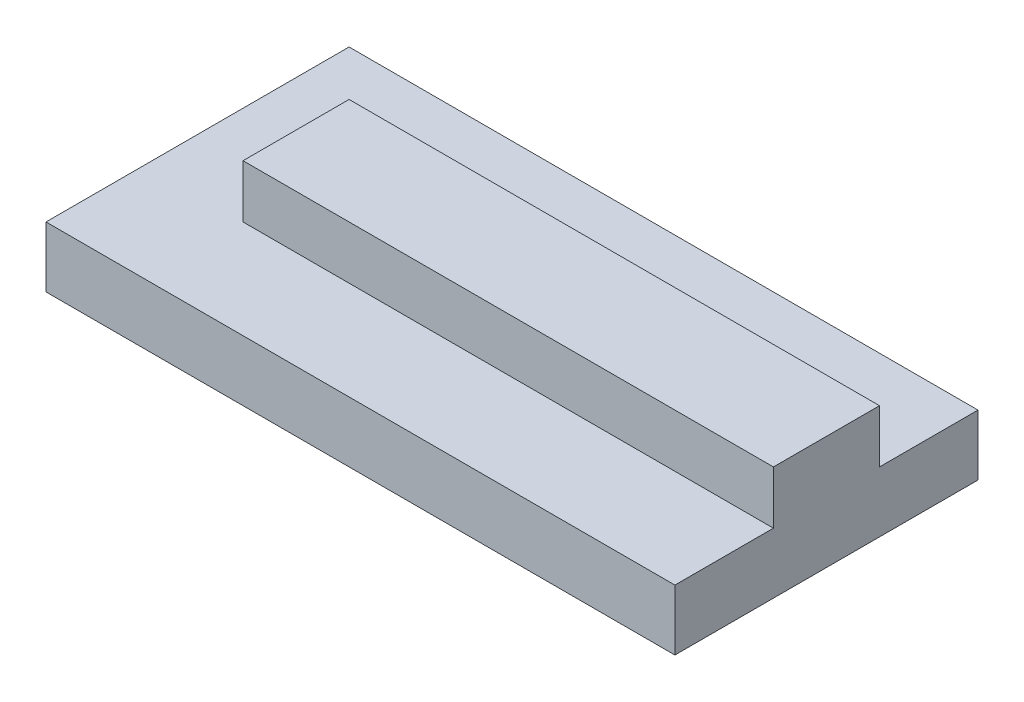
ISO-10303-21;
HEADER;
FILE_DESCRIPTION(('STEP AP214'),'2;1');
FILE_NAME('part.step','',(''),(''),'','','');
FILE_SCHEMA(('AUTOMOTIVE_DESIGN { 1 0 10303 214 1 1 1 1 }'));
ENDSEC;
DATA;
#1=APPLICATION_CONTEXT('core data for automotive mechanical design processes');
#2=APPLICATION_PROTOCOL_DEFINITION('international standard','automotive_design',2000,#1);
#3=PRODUCT_CONTEXT('',#1,'mechanical');
#4=PRODUCT('Part','Part','',(#3));
#5=PRODUCT_RELATED_PRODUCT_CATEGORY('part','',(#4));
#6=PRODUCT_DEFINITION_FORMATION('','',#4);
#7=PRODUCT_DEFINITION_CONTEXT('part definition',#1,'design');
#8=PRODUCT_DEFINITION('design','',#6,#7);
#9=PRODUCT_DEFINITION_SHAPE('','',#8);
#10=(LENGTH_UNIT() NAMED_UNIT(*) SI_UNIT(.MILLI.,.METRE.));
#11=(NAMED_UNIT(*) PLANE_ANGLE_UNIT() SI_UNIT($,.RADIAN.));
#12=(NAMED_UNIT(*) SI_UNIT($,.STERADIAN.) SOLID_ANGLE_UNIT());
#13=UNCERTAINTY_MEASURE_WITH_UNIT(LENGTH_MEASURE(1.E-05),#10,'distance_accuracy_value','');
#14=(GEOMETRIC_REPRESENTATION_CONTEXT(3) GLOBAL_UNCERTAINTY_ASSIGNED_CONTEXT((#13)) GLOBAL_UNIT_ASSIGNED_CONTEXT((#10,
#11,#12)) REPRESENTATION_CONTEXT('',''));
#15=CARTESIAN_POINT('',(0.,0.,0.));
#16=DIRECTION('',(0.,0.,1.));
#17=DIRECTION('',(1.,0.,0.));
#18=AXIS2_PLACEMENT_3D('',#15,#16,#17);
#19=CARTESIAN_POINT('',(0.,4.,0.));
#20=DIRECTION('',(0.,-1.,0.));
#21=DIRECTION('',(0.,0.,-1.));
#22=AXIS2_PLACEMENT_3D('',#19,#20,#21);
#23=PLANE('',#22);
#24=DIRECTION('',(-1.,0.,0.));
#25=VECTOR('',#24,1.);
#26=CARTESIAN_POINT('',(6.5,4.,-13.5));
#27=LINE('',#26,#25);
#28=CARTESIAN_POINT('',(41.5,4.,-13.5));
#29=VERTEX_POINT('',#28);
#30=CARTESIAN_POINT('',(6.5,4.,-13.5));
#31=VERTEX_POINT('',#30);
#32=EDGE_CURVE('E121',#29,#31,#27,.T.);
#33=ORIENTED_EDGE('',*,*,#32,.F.);
#34=DIRECTION('',(0.,0.,-1.));
#35=VECTOR('',#34,1.);
#36=CARTESIAN_POINT('',(41.5,4.,0.));
#37=LINE('',#36,#35);
#38=CARTESIAN_POINT('',(41.5,4.,-20.));
#39=VERTEX_POINT('',#38);
#40=EDGE_CURVE('E139',#29,#39,#37,.T.);
#41=ORIENTED_EDGE('',*,*,#40,.T.);
#42=DIRECTION('',(-1.,0.,0.));
#43=VECTOR('',#42,1.);
#44=CARTESIAN_POINT('',(0.,4.,-20.));
#45=LINE('',#44,#43);
#46=CARTESIAN_POINT('',(0.,4.,-20.));
#47=VERTEX_POINT('',#46);
#48=EDGE_CURVE('E142',#39,#47,#45,.T.);
#49=ORIENTED_EDGE('',*,*,#48,.T.);
#50=DIRECTION('',(0.,0.,1.));
#51=VECTOR('',#50,1.);
#52=CARTESIAN_POINT('',(0.,4.,0.));
#53=LINE('',#52,#51);
#54=CARTESIAN_POINT('',(0.,4.,0.));
#55=VERTEX_POINT('',#54);
#56=EDGE_CURVE('E133',#47,#55,#53,.T.);
#57=ORIENTED_EDGE('',*,*,#56,.T.);
#58=DIRECTION('',(1.,0.,0.));
#59=VECTOR('',#58,1.);
#60=CARTESIAN_POINT('',(0.,4.,0.));
#61=LINE('',#60,#59);
#62=CARTESIAN_POINT('',(41.5,4.,0.));
#63=VERTEX_POINT('',#62);
#64=EDGE_CURVE('E136',#55,#63,#61,.T.);
#65=ORIENTED_EDGE('',*,*,#64,.T.);
#66=CARTESIAN_POINT('',(41.5,4.,-6.5));
#67=VERTEX_POINT('',#66);
#68=EDGE_CURVE('E140',#63,#67,#37,.T.);
#69=ORIENTED_EDGE('',*,*,#68,.T.);
#70=DIRECTION('',(1.,0.,0.));
#71=VECTOR('',#70,1.);
#72=CARTESIAN_POINT('',(6.5,4.,-6.5));
#73=LINE('',#72,#71);
#74=CARTESIAN_POINT('',(6.5,4.,-6.5));
#75=VERTEX_POINT('',#74);
#76=EDGE_CURVE('E59',#75,#67,#73,.T.);
#77=ORIENTED_EDGE('',*,*,#76,.F.);
#78=DIRECTION('',(0.,0.,1.));
#79=VECTOR('',#78,1.);
#80=CARTESIAN_POINT('',(6.5,4.,-6.5));
#81=LINE('',#80,#79);
#82=EDGE_CURVE('E54',#31,#75,#81,.T.);
#83=ORIENTED_EDGE('',*,*,#82,.F.);
#84=EDGE_LOOP('',(#33,#41,#49,#57,#65,#69,#77,#83));
#85=FACE_BOUND('',#84,.T.);
#86=ADVANCED_FACE('F39',(#85),#23,.F.);
#87=CARTESIAN_POINT('',(0.,4.,0.));
#88=DIRECTION('',(1.,0.,0.));
#89=DIRECTION('',(0.,0.,-1.));
#90=AXIS2_PLACEMENT_3D('',#87,#88,#89);
#91=PLANE('',#90);
#92=DIRECTION('',(0.,0.,1.));
#93=VECTOR('',#92,1.);
#94=CARTESIAN_POINT('',(0.,0.,0.));
#95=LINE('',#94,#93);
#96=CARTESIAN_POINT('',(0.,0.,-20.));
#97=VERTEX_POINT('',#96);
#98=CARTESIAN_POINT('',(0.,0.,0.));
#99=VERTEX_POINT('',#98);
#100=EDGE_CURVE('E124',#97,#99,#95,.T.);
#101=ORIENTED_EDGE('',*,*,#100,.T.);
#102=DIRECTION('',(0.,-1.,0.));
#103=VECTOR('',#102,1.);
#104=CARTESIAN_POINT('',(0.,4.,0.));
#105=LINE('',#104,#103);
#106=EDGE_CURVE('E11',#55,#99,#105,.T.);
#107=ORIENTED_EDGE('',*,*,#106,.F.);
#108=ORIENTED_EDGE('',*,*,#56,.F.);
#109=DIRECTION('',(0.,-1.,0.));
#110=VECTOR('',#109,1.);
#111=CARTESIAN_POINT('',(0.,4.,-20.));
#112=LINE('',#111,#110);
#113=EDGE_CURVE('E143',#47,#97,#112,.T.);
#114=ORIENTED_EDGE('',*,*,#113,.T.);
#115=EDGE_LOOP('',(#101,#107,#108,#114));
#116=FACE_BOUND('',#115,.T.);
#117=ADVANCED_FACE('F41',(#116),#91,.F.);
#118=CARTESIAN_POINT('',(0.,4.,0.));
#119=DIRECTION('',(0.,0.,-1.));
#120=DIRECTION('',(-1.,0.,0.));
#121=AXIS2_PLACEMENT_3D('',#118,#119,#120);
#122=PLANE('',#121);
#123=DIRECTION('',(1.,0.,0.));
#124=VECTOR('',#123,1.);
#125=CARTESIAN_POINT('',(0.,0.,0.));
#126=LINE('',#125,#124);
#127=CARTESIAN_POINT('',(41.5,0.,0.));
#128=VERTEX_POINT('',#127);
#129=EDGE_CURVE('E127',#99,#128,#126,.T.);
#130=ORIENTED_EDGE('',*,*,#129,.T.);
#131=DIRECTION('',(0.,-1.,0.));
#132=VECTOR('',#131,1.);
#133=CARTESIAN_POINT('',(41.5,4.,0.));
#134=LINE('',#133,#132);
#135=EDGE_CURVE('E47',#63,#128,#134,.T.);
#136=ORIENTED_EDGE('',*,*,#135,.F.);
#137=ORIENTED_EDGE('',*,*,#64,.F.);
#138=ORIENTED_EDGE('',*,*,#106,.T.);
#139=EDGE_LOOP('',(#130,#136,#137,#138));
#140=FACE_BOUND('',#139,.T.);
#141=ADVANCED_FACE('F199',(#140),#122,.F.);
#142=CARTESIAN_POINT('',(41.5,4.,0.));
#143=DIRECTION('',(-1.,0.,0.));
#144=DIRECTION('',(0.,0.,1.));
#145=AXIS2_PLACEMENT_3D('',#142,#143,#144);
#146=PLANE('',#145);
#147=DIRECTION('',(0.,0.,-1.));
#148=VECTOR('',#147,1.);
#149=CARTESIAN_POINT('',(41.5,0.,0.));
#150=LINE('',#149,#148);
#151=CARTESIAN_POINT('',(41.5,0.,-20.));
#152=VERTEX_POINT('',#151);
#153=EDGE_CURVE('E146',#128,#152,#150,.T.);
#154=ORIENTED_EDGE('',*,*,#153,.T.);
#155=DIRECTION('',(0.,-1.,0.));
#156=VECTOR('',#155,1.);
#157=CARTESIAN_POINT('',(41.5,4.,-20.));
#158=LINE('',#157,#156);
#159=EDGE_CURVE('E151',#39,#152,#158,.T.);
#160=ORIENTED_EDGE('',*,*,#159,.F.);
#161=ORIENTED_EDGE('',*,*,#40,.F.);
#162=DIRECTION('',(0.,-1.,0.));
#163=VECTOR('',#162,1.);
#164=CARTESIAN_POINT('',(41.5,7.5,-13.5));
#165=LINE('',#164,#163);
#166=CARTESIAN_POINT('',(41.5,7.5,-13.5));
#167=VERTEX_POINT('',#166);
#168=EDGE_CURVE('E129',#167,#29,#165,.T.);
#169=ORIENTED_EDGE('',*,*,#168,.F.);
#170=DIRECTION('',(0.,0.,-1.));
#171=VECTOR('',#170,1.);
#172=CARTESIAN_POINT('',(41.5,7.5,-6.5));
#173=LINE('',#172,#171);
#174=CARTESIAN_POINT('',(41.5,7.5,-6.5));
#175=VERTEX_POINT('',#174);
#176=EDGE_CURVE('E111',#175,#167,#173,.T.);
#177=ORIENTED_EDGE('',*,*,#176,.F.);
#178=DIRECTION('',(0.,-1.,0.));
#179=VECTOR('',#178,1.);
#180=CARTESIAN_POINT('',(41.5,7.5,-6.5));
#181=LINE('',#180,#179);
#182=EDGE_CURVE('E108',#175,#67,#181,.T.);
#183=ORIENTED_EDGE('',*,*,#182,.T.);
#184=ORIENTED_EDGE('',*,*,#68,.F.);
#185=ORIENTED_EDGE('',*,*,#135,.T.);
#186=EDGE_LOOP('',(#154,#160,#161,#169,#177,#183,#184,#185));
#187=FACE_BOUND('',#186,.T.);
#188=ADVANCED_FACE('F158',(#187),#146,.F.);
#189=CARTESIAN_POINT('',(0.,4.,-20.));
#190=DIRECTION('',(0.,0.,1.));
#191=DIRECTION('',(1.,0.,0.));
#192=AXIS2_PLACEMENT_3D('',#189,#190,#191);
#193=PLANE('',#192);
#194=DIRECTION('',(-1.,0.,0.));
#195=VECTOR('',#194,1.);
#196=CARTESIAN_POINT('',(0.,0.,-20.));
#197=LINE('',#196,#195);
#198=EDGE_CURVE('E137',#152,#97,#197,.T.);
#199=ORIENTED_EDGE('',*,*,#198,.T.);
#200=ORIENTED_EDGE('',*,*,#113,.F.);
#201=ORIENTED_EDGE('',*,*,#48,.F.);
#202=ORIENTED_EDGE('',*,*,#159,.T.);
#203=EDGE_LOOP('',(#199,#200,#201,#202));
#204=FACE_BOUND('',#203,.T.);
#205=ADVANCED_FACE('F167',(#204),#193,.F.);
#206=CARTESIAN_POINT('',(0.,0.,0.));
#207=DIRECTION('',(0.,-1.,0.));
#208=DIRECTION('',(0.,0.,-1.));
#209=AXIS2_PLACEMENT_3D('',#206,#207,#208);
#210=PLANE('',#209);
#211=ORIENTED_EDGE('',*,*,#100,.F.);
#212=ORIENTED_EDGE('',*,*,#198,.F.);
#213=ORIENTED_EDGE('',*,*,#153,.F.);
#214=ORIENTED_EDGE('',*,*,#129,.F.);
#215=EDGE_LOOP('',(#211,#212,#213,#214));
#216=FACE_BOUND('',#215,.T.);
#217=ADVANCED_FACE('F164',(#216),#210,.T.);
#218=CARTESIAN_POINT('',(6.5,7.5,-6.5));
#219=DIRECTION('',(1.,0.,0.));
#220=DIRECTION('',(0.,0.,-1.));
#221=AXIS2_PLACEMENT_3D('',#218,#219,#220);
#222=PLANE('',#221);
#223=ORIENTED_EDGE('',*,*,#82,.T.);
#224=DIRECTION('',(0.,-1.,0.));
#225=VECTOR('',#224,1.);
#226=CARTESIAN_POINT('',(6.5,7.5,-6.5));
#227=LINE('',#226,#225);
#228=CARTESIAN_POINT('',(6.5,7.5,-6.5));
#229=VERTEX_POINT('',#228);
#230=EDGE_CURVE('E106',#229,#75,#227,.T.);
#231=ORIENTED_EDGE('',*,*,#230,.F.);
#232=DIRECTION('',(0.,0.,1.));
#233=VECTOR('',#232,1.);
#234=CARTESIAN_POINT('',(6.5,7.5,-6.5));
#235=LINE('',#234,#233);
#236=CARTESIAN_POINT('',(6.5,7.5,-13.5));
#237=VERTEX_POINT('',#236);
#238=EDGE_CURVE('E112',#237,#229,#235,.T.);
#239=ORIENTED_EDGE('',*,*,#238,.F.);
#240=DIRECTION('',(0.,-1.,0.));
#241=VECTOR('',#240,1.);
#242=CARTESIAN_POINT('',(6.5,7.5,-13.5));
#243=LINE('',#242,#241);
#244=EDGE_CURVE('E177',#237,#31,#243,.T.);
#245=ORIENTED_EDGE('',*,*,#244,.T.);
#246=EDGE_LOOP('',(#223,#231,#239,#245));
#247=FACE_BOUND('',#246,.T.);
#248=ADVANCED_FACE('F123',(#247),#222,.F.);
#249=CARTESIAN_POINT('',(6.5,7.5,-6.5));
#250=DIRECTION('',(0.,0.,-1.));
#251=DIRECTION('',(-1.,0.,0.));
#252=AXIS2_PLACEMENT_3D('',#249,#250,#251);
#253=PLANE('',#252);
#254=ORIENTED_EDGE('',*,*,#76,.T.);
#255=ORIENTED_EDGE('',*,*,#182,.F.);
#256=DIRECTION('',(1.,0.,0.));
#257=VECTOR('',#256,1.);
#258=CARTESIAN_POINT('',(6.5,7.5,-6.5));
#259=LINE('',#258,#257);
#260=EDGE_CURVE('E102',#229,#175,#259,.T.);
#261=ORIENTED_EDGE('',*,*,#260,.F.);
#262=ORIENTED_EDGE('',*,*,#230,.T.);
#263=EDGE_LOOP('',(#254,#255,#261,#262));
#264=FACE_BOUND('',#263,.T.);
#265=ADVANCED_FACE('F104',(#264),#253,.F.);
#266=CARTESIAN_POINT('',(6.5,7.5,-13.5));
#267=DIRECTION('',(0.,0.,1.));
#268=DIRECTION('',(1.,0.,0.));
#269=AXIS2_PLACEMENT_3D('',#266,#267,#268);
#270=PLANE('',#269);
#271=ORIENTED_EDGE('',*,*,#32,.T.);
#272=ORIENTED_EDGE('',*,*,#244,.F.);
#273=DIRECTION('',(-1.,0.,0.));
#274=VECTOR('',#273,1.);
#275=CARTESIAN_POINT('',(6.5,7.5,-13.5));
#276=LINE('',#275,#274);
#277=EDGE_CURVE('E117',#167,#237,#276,.T.);
#278=ORIENTED_EDGE('',*,*,#277,.F.);
#279=ORIENTED_EDGE('',*,*,#168,.T.);
#280=EDGE_LOOP('',(#271,#272,#278,#279));
#281=FACE_BOUND('',#280,.T.);
#282=ADVANCED_FACE('F176',(#281),#270,.F.);
#283=CARTESIAN_POINT('',(0.,7.5,0.));
#284=DIRECTION('',(0.,-1.,0.));
#285=DIRECTION('',(0.,0.,-1.));
#286=AXIS2_PLACEMENT_3D('',#283,#284,#285);
#287=PLANE('',#286);
#288=ORIENTED_EDGE('',*,*,#238,.T.);
#289=ORIENTED_EDGE('',*,*,#260,.T.);
#290=ORIENTED_EDGE('',*,*,#176,.T.);
#291=ORIENTED_EDGE('',*,*,#277,.T.);
#292=EDGE_LOOP('',(#288,#289,#290,#291));
#293=FACE_BOUND('',#292,.T.);
#294=ADVANCED_FACE('F115',(#293),#287,.F.);
#295=CLOSED_SHELL('',(#86,#117,#141,#188,#205,#217,#248,#265,#282,#294));
#296=MANIFOLD_SOLID_BREP('B2',#295);
#297=ADVANCED_BREP_SHAPE_REPRESENTATION('',(#18,#296),#14);
#298=SHAPE_DEFINITION_REPRESENTATION(#9,#297);
ENDSEC;
END-ISO-10303-21;
